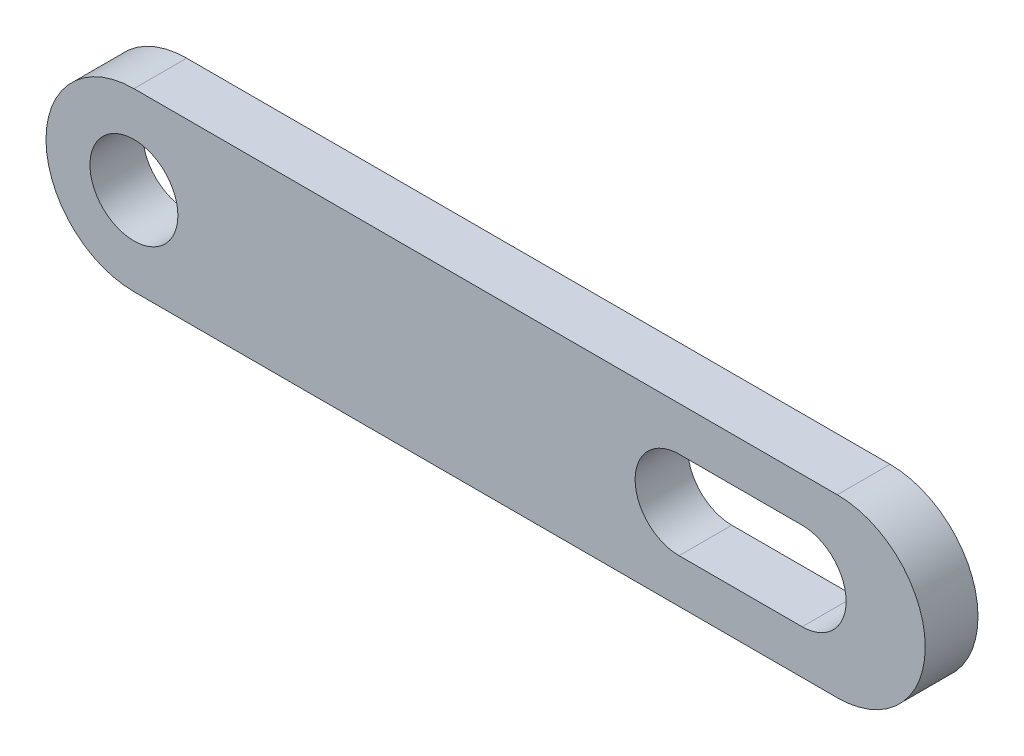
ISO-10303-21;
HEADER;
FILE_DESCRIPTION(('STEP AP214'),'2;1');
FILE_NAME('part.step','',(''),(''),'','','');
FILE_SCHEMA(('AUTOMOTIVE_DESIGN { 1 0 10303 214 1 1 1 1 }'));
ENDSEC;
DATA;
#1=APPLICATION_CONTEXT('core data for automotive mechanical design processes');
#2=APPLICATION_PROTOCOL_DEFINITION('international standard','automotive_design',2000,#1);
#3=PRODUCT_CONTEXT('',#1,'mechanical');
#4=PRODUCT('Part','Part','',(#3));
#5=PRODUCT_RELATED_PRODUCT_CATEGORY('part','',(#4));
#6=PRODUCT_DEFINITION_FORMATION('','',#4);
#7=PRODUCT_DEFINITION_CONTEXT('part definition',#1,'design');
#8=PRODUCT_DEFINITION('design','',#6,#7);
#9=PRODUCT_DEFINITION_SHAPE('','',#8);
#10=(LENGTH_UNIT() NAMED_UNIT(*) SI_UNIT(.MILLI.,.METRE.));
#11=(NAMED_UNIT(*) PLANE_ANGLE_UNIT() SI_UNIT($,.RADIAN.));
#12=(NAMED_UNIT(*) SI_UNIT($,.STERADIAN.) SOLID_ANGLE_UNIT());
#13=UNCERTAINTY_MEASURE_WITH_UNIT(LENGTH_MEASURE(1.E-05),#10,'distance_accuracy_value','');
#14=(GEOMETRIC_REPRESENTATION_CONTEXT(3) GLOBAL_UNCERTAINTY_ASSIGNED_CONTEXT((#13)) GLOBAL_UNIT_ASSIGNED_CONTEXT((#10,
#11,#12)) REPRESENTATION_CONTEXT('',''));
#15=CARTESIAN_POINT('',(0.,0.,0.));
#16=DIRECTION('',(0.,0.,1.));
#17=DIRECTION('',(1.,0.,0.));
#18=AXIS2_PLACEMENT_3D('',#15,#16,#17);
#19=CARTESIAN_POINT('',(-20.,0.,3.));
#20=DIRECTION('',(0.,0.,-1.));
#21=DIRECTION('',(-1.,0.,0.));
#22=AXIS2_PLACEMENT_3D('',#19,#20,#21);
#23=CYLINDRICAL_SURFACE('',#22,5.);
#24=CARTESIAN_POINT('',(-20.,0.,0.));
#25=DIRECTION('',(0.,0.,1.));
#26=DIRECTION('',(1.,0.,0.));
#27=AXIS2_PLACEMENT_3D('',#24,#25,#26);
#28=CIRCLE('',#27,5.);
#29=CARTESIAN_POINT('',(-20.,5.,0.));
#30=VERTEX_POINT('',#29);
#31=CARTESIAN_POINT('',(-20.,-5.,0.));
#32=VERTEX_POINT('',#31);
#33=EDGE_CURVE('E115',#30,#32,#28,.T.);
#34=ORIENTED_EDGE('',*,*,#33,.T.);
#35=DIRECTION('',(0.,0.,-1.));
#36=VECTOR('',#35,1.);
#37=CARTESIAN_POINT('',(-20.,-5.,3.));
#38=LINE('',#37,#36);
#39=CARTESIAN_POINT('',(-20.,-5.,3.));
#40=VERTEX_POINT('',#39);
#41=EDGE_CURVE('E11',#40,#32,#38,.T.);
#42=ORIENTED_EDGE('',*,*,#41,.F.);
#43=CARTESIAN_POINT('',(-20.,0.,3.));
#44=DIRECTION('',(0.,0.,1.));
#45=DIRECTION('',(1.,0.,0.));
#46=AXIS2_PLACEMENT_3D('',#43,#44,#45);
#47=CIRCLE('',#46,5.);
#48=CARTESIAN_POINT('',(-20.,5.,3.));
#49=VERTEX_POINT('',#48);
#50=EDGE_CURVE('E144',#49,#40,#47,.T.);
#51=ORIENTED_EDGE('',*,*,#50,.F.);
#52=DIRECTION('',(0.,0.,-1.));
#53=VECTOR('',#52,1.);
#54=CARTESIAN_POINT('',(-20.,5.,3.));
#55=LINE('',#54,#53);
#56=EDGE_CURVE('E154',#49,#30,#55,.T.);
#57=ORIENTED_EDGE('',*,*,#56,.T.);
#58=EDGE_LOOP('',(#34,#42,#51,#57));
#59=FACE_BOUND('',#58,.T.);
#60=ADVANCED_FACE('F37',(#59),#23,.T.);
#61=CARTESIAN_POINT('',(-20.,-5.,3.));
#62=DIRECTION('',(0.,1.,0.));
#63=DIRECTION('',(-1.,0.,0.));
#64=AXIS2_PLACEMENT_3D('',#61,#62,#63);
#65=PLANE('',#64);
#66=DIRECTION('',(1.,0.,0.));
#67=VECTOR('',#66,1.);
#68=CARTESIAN_POINT('',(-20.,-5.,0.));
#69=LINE('',#68,#67);
#70=CARTESIAN_POINT('',(20.,-4.99999999999999,0.));
#71=VERTEX_POINT('',#70);
#72=EDGE_CURVE('E157',#32,#71,#69,.T.);
#73=ORIENTED_EDGE('',*,*,#72,.T.);
#74=DIRECTION('',(0.,0.,-1.));
#75=VECTOR('',#74,1.);
#76=CARTESIAN_POINT('',(20.,-4.99999999999999,3.));
#77=LINE('',#76,#75);
#78=CARTESIAN_POINT('',(20.,-4.99999999999999,3.));
#79=VERTEX_POINT('',#78);
#80=EDGE_CURVE('E44',#79,#71,#77,.T.);
#81=ORIENTED_EDGE('',*,*,#80,.F.);
#82=DIRECTION('',(1.,0.,0.));
#83=VECTOR('',#82,1.);
#84=CARTESIAN_POINT('',(-20.,-5.,3.));
#85=LINE('',#84,#83);
#86=EDGE_CURVE('E147',#40,#79,#85,.T.);
#87=ORIENTED_EDGE('',*,*,#86,.F.);
#88=ORIENTED_EDGE('',*,*,#41,.T.);
#89=EDGE_LOOP('',(#73,#81,#87,#88));
#90=FACE_BOUND('',#89,.T.);
#91=ADVANCED_FACE('F186',(#90),#65,.F.);
#92=CARTESIAN_POINT('',(20.,0.,3.));
#93=DIRECTION('',(0.,0.,-1.));
#94=DIRECTION('',(-1.,0.,0.));
#95=AXIS2_PLACEMENT_3D('',#92,#93,#94);
#96=CYLINDRICAL_SURFACE('',#95,5.);
#97=CARTESIAN_POINT('',(20.,0.,0.));
#98=DIRECTION('',(0.,0.,1.));
#99=DIRECTION('',(1.,0.,0.));
#100=AXIS2_PLACEMENT_3D('',#97,#98,#99);
#101=CIRCLE('',#100,5.);
#102=CARTESIAN_POINT('',(20.,5.00000000000001,0.));
#103=VERTEX_POINT('',#102);
#104=EDGE_CURVE('E159',#71,#103,#101,.T.);
#105=ORIENTED_EDGE('',*,*,#104,.T.);
#106=DIRECTION('',(0.,0.,-1.));
#107=VECTOR('',#106,1.);
#108=CARTESIAN_POINT('',(20.,5.00000000000001,3.));
#109=LINE('',#108,#107);
#110=CARTESIAN_POINT('',(20.,5.00000000000001,3.));
#111=VERTEX_POINT('',#110);
#112=EDGE_CURVE('E164',#111,#103,#109,.T.);
#113=ORIENTED_EDGE('',*,*,#112,.F.);
#114=CARTESIAN_POINT('',(20.,0.,3.));
#115=DIRECTION('',(0.,0.,1.));
#116=DIRECTION('',(1.,0.,0.));
#117=AXIS2_PLACEMENT_3D('',#114,#115,#116);
#118=CIRCLE('',#117,5.);
#119=EDGE_CURVE('E150',#79,#111,#118,.T.);
#120=ORIENTED_EDGE('',*,*,#119,.F.);
#121=ORIENTED_EDGE('',*,*,#80,.T.);
#122=EDGE_LOOP('',(#105,#113,#120,#121));
#123=FACE_BOUND('',#122,.T.);
#124=ADVANCED_FACE('F171',(#123),#96,.T.);
#125=CARTESIAN_POINT('',(-20.,5.,3.));
#126=DIRECTION('',(0.,-1.,0.));
#127=DIRECTION('',(1.,0.,0.));
#128=AXIS2_PLACEMENT_3D('',#125,#126,#127);
#129=PLANE('',#128);
#130=DIRECTION('',(-1.,0.,0.));
#131=VECTOR('',#130,1.);
#132=CARTESIAN_POINT('',(-20.,5.,0.));
#133=LINE('',#132,#131);
#134=EDGE_CURVE('E148',#103,#30,#133,.T.);
#135=ORIENTED_EDGE('',*,*,#134,.T.);
#136=ORIENTED_EDGE('',*,*,#56,.F.);
#137=DIRECTION('',(-1.,0.,0.));
#138=VECTOR('',#137,1.);
#139=CARTESIAN_POINT('',(-20.,5.,3.));
#140=LINE('',#139,#138);
#141=EDGE_CURVE('E152',#111,#49,#140,.T.);
#142=ORIENTED_EDGE('',*,*,#141,.F.);
#143=ORIENTED_EDGE('',*,*,#112,.T.);
#144=EDGE_LOOP('',(#135,#136,#142,#143));
#145=FACE_BOUND('',#144,.T.);
#146=ADVANCED_FACE('F179',(#145),#129,.F.);
#147=CARTESIAN_POINT('',(-20.,0.,3.));
#148=DIRECTION('',(0.,0.,1.));
#149=DIRECTION('',(1.,0.,0.));
#150=AXIS2_PLACEMENT_3D('',#147,#148,#149);
#151=PLANE('',#150);
#152=CARTESIAN_POINT('',(11.,0.,3.));
#153=DIRECTION('',(0.,0.,1.));
#154=DIRECTION('',(1.,0.,0.));
#155=AXIS2_PLACEMENT_3D('',#152,#153,#154);
#156=CIRCLE('',#155,2.5);
#157=CARTESIAN_POINT('',(11.,2.5,3.));
#158=VERTEX_POINT('',#157);
#159=CARTESIAN_POINT('',(11.,-2.5,3.));
#160=VERTEX_POINT('',#159);
#161=EDGE_CURVE('E51',#158,#160,#156,.T.);
#162=ORIENTED_EDGE('',*,*,#161,.F.);
#163=DIRECTION('',(-1.,0.,0.));
#164=VECTOR('',#163,1.);
#165=CARTESIAN_POINT('',(11.,2.5,3.));
#166=LINE('',#165,#164);
#167=CARTESIAN_POINT('',(18.,2.5,3.));
#168=VERTEX_POINT('',#167);
#169=EDGE_CURVE('E109',#168,#158,#166,.T.);
#170=ORIENTED_EDGE('',*,*,#169,.F.);
#171=CARTESIAN_POINT('',(18.,0.,3.));
#172=DIRECTION('',(0.,0.,1.));
#173=DIRECTION('',(1.,0.,0.));
#174=AXIS2_PLACEMENT_3D('',#171,#172,#173);
#175=CIRCLE('',#174,2.5);
#176=CARTESIAN_POINT('',(18.,-2.5,3.));
#177=VERTEX_POINT('',#176);
#178=EDGE_CURVE('E129',#177,#168,#175,.T.);
#179=ORIENTED_EDGE('',*,*,#178,.F.);
#180=DIRECTION('',(1.,0.,0.));
#181=VECTOR('',#180,1.);
#182=CARTESIAN_POINT('',(11.,-2.5,3.));
#183=LINE('',#182,#181);
#184=EDGE_CURVE('E123',#160,#177,#183,.T.);
#185=ORIENTED_EDGE('',*,*,#184,.F.);
#186=EDGE_LOOP('',(#162,#170,#179,#185));
#187=FACE_BOUND('',#186,.T.);
#188=CARTESIAN_POINT('',(-20.,0.,3.));
#189=DIRECTION('',(0.,0.,1.));
#190=DIRECTION('',(1.,0.,0.));
#191=AXIS2_PLACEMENT_3D('',#188,#189,#190);
#192=CIRCLE('',#191,2.5);
#193=CARTESIAN_POINT('',(-17.5,0.,3.));
#194=VERTEX_POINT('',#193);
#195=EDGE_CURVE('E138',#194,#194,#192,.T.);
#196=ORIENTED_EDGE('',*,*,#195,.F.);
#197=EDGE_LOOP('',(#196));
#198=FACE_BOUND('',#197,.T.);
#199=ORIENTED_EDGE('',*,*,#50,.T.);
#200=ORIENTED_EDGE('',*,*,#86,.T.);
#201=ORIENTED_EDGE('',*,*,#119,.T.);
#202=ORIENTED_EDGE('',*,*,#141,.T.);
#203=EDGE_LOOP('',(#199,#200,#201,#202));
#204=FACE_BOUND('',#203,.T.);
#205=ADVANCED_FACE('F185',(#187,#198,#204),#151,.T.);
#206=CARTESIAN_POINT('',(-20.,0.,0.));
#207=DIRECTION('',(0.,0.,1.));
#208=DIRECTION('',(1.,0.,0.));
#209=AXIS2_PLACEMENT_3D('',#206,#207,#208);
#210=PLANE('',#209);
#211=DIRECTION('',(1.,0.,0.));
#212=VECTOR('',#211,1.);
#213=CARTESIAN_POINT('',(11.,2.5,0.));
#214=LINE('',#213,#212);
#215=CARTESIAN_POINT('',(11.,2.5,0.));
#216=VERTEX_POINT('',#215);
#217=CARTESIAN_POINT('',(18.,2.5,0.));
#218=VERTEX_POINT('',#217);
#219=EDGE_CURVE('E121',#216,#218,#214,.T.);
#220=ORIENTED_EDGE('',*,*,#219,.F.);
#221=CARTESIAN_POINT('',(11.,0.,0.));
#222=DIRECTION('',(0.,0.,1.));
#223=DIRECTION('',(1.,0.,0.));
#224=AXIS2_PLACEMENT_3D('',#221,#222,#223);
#225=CIRCLE('',#224,2.5);
#226=CARTESIAN_POINT('',(11.,-2.5,0.));
#227=VERTEX_POINT('',#226);
#228=EDGE_CURVE('E103',#227,#216,#225,.F.);
#229=ORIENTED_EDGE('',*,*,#228,.F.);
#230=DIRECTION('',(-1.,0.,0.));
#231=VECTOR('',#230,1.);
#232=CARTESIAN_POINT('',(11.,-2.5,0.));
#233=LINE('',#232,#231);
#234=CARTESIAN_POINT('',(18.,-2.5,0.));
#235=VERTEX_POINT('',#234);
#236=EDGE_CURVE('E112',#235,#227,#233,.T.);
#237=ORIENTED_EDGE('',*,*,#236,.F.);
#238=CARTESIAN_POINT('',(18.,0.,0.));
#239=DIRECTION('',(0.,0.,1.));
#240=DIRECTION('',(1.,0.,0.));
#241=AXIS2_PLACEMENT_3D('',#238,#239,#240);
#242=CIRCLE('',#241,2.5);
#243=EDGE_CURVE('E59',#218,#235,#242,.F.);
#244=ORIENTED_EDGE('',*,*,#243,.F.);
#245=EDGE_LOOP('',(#220,#229,#237,#244));
#246=FACE_BOUND('',#245,.T.);
#247=CARTESIAN_POINT('',(-20.,0.,0.));
#248=DIRECTION('',(0.,0.,1.));
#249=DIRECTION('',(1.,0.,0.));
#250=AXIS2_PLACEMENT_3D('',#247,#248,#249);
#251=CIRCLE('',#250,2.5);
#252=CARTESIAN_POINT('',(-17.5,0.,0.));
#253=VERTEX_POINT('',#252);
#254=EDGE_CURVE('E141',#253,#253,#251,.F.);
#255=ORIENTED_EDGE('',*,*,#254,.F.);
#256=EDGE_LOOP('',(#255));
#257=FACE_BOUND('',#256,.T.);
#258=ORIENTED_EDGE('',*,*,#33,.F.);
#259=ORIENTED_EDGE('',*,*,#134,.F.);
#260=ORIENTED_EDGE('',*,*,#104,.F.);
#261=ORIENTED_EDGE('',*,*,#72,.F.);
#262=EDGE_LOOP('',(#258,#259,#260,#261));
#263=FACE_BOUND('',#262,.T.);
#264=ADVANCED_FACE('F118',(#246,#257,#263),#210,.F.);
#265=CARTESIAN_POINT('',(-20.,0.,-0.00100000000000013));
#266=DIRECTION('',(0.,0.,1.));
#267=DIRECTION('',(1.,0.,0.));
#268=AXIS2_PLACEMENT_3D('',#265,#266,#267);
#269=CYLINDRICAL_SURFACE('',#268,2.5);
#270=CARTESIAN_POINT('',(-17.5,0.,3.));
#271=CARTESIAN_POINT('',(-17.5,0.,2.96875));
#272=CARTESIAN_POINT('',(-17.5,0.,2.9375));
#273=CARTESIAN_POINT('',(-17.5,0.,2.875));
#274=CARTESIAN_POINT('',(-17.5,0.,2.84375));
#275=CARTESIAN_POINT('',(-17.5,0.,2.78125));
#276=CARTESIAN_POINT('',(-17.5,0.,2.75));
#277=CARTESIAN_POINT('',(-17.5,0.,2.6875));
#278=CARTESIAN_POINT('',(-17.5,0.,2.65625));
#279=CARTESIAN_POINT('',(-17.5,0.,2.59375));
#280=CARTESIAN_POINT('',(-17.5,0.,2.5625));
#281=CARTESIAN_POINT('',(-17.5,0.,2.5));
#282=CARTESIAN_POINT('',(-17.5,0.,2.46875));
#283=CARTESIAN_POINT('',(-17.5,0.,2.40625));
#284=CARTESIAN_POINT('',(-17.5,0.,2.375));
#285=CARTESIAN_POINT('',(-17.5,0.,2.3125));
#286=CARTESIAN_POINT('',(-17.5,0.,2.28125));
#287=CARTESIAN_POINT('',(-17.5,0.,2.21875));
#288=CARTESIAN_POINT('',(-17.5,0.,2.1875));
#289=CARTESIAN_POINT('',(-17.5,0.,2.125));
#290=CARTESIAN_POINT('',(-17.5,0.,2.09375));
#291=CARTESIAN_POINT('',(-17.5,0.,2.03125));
#292=CARTESIAN_POINT('',(-17.5,0.,2.));
#293=CARTESIAN_POINT('',(-17.5,0.,1.9375));
#294=CARTESIAN_POINT('',(-17.5,0.,1.90625));
#295=CARTESIAN_POINT('',(-17.5,0.,1.84375));
#296=CARTESIAN_POINT('',(-17.5,0.,1.8125));
#297=CARTESIAN_POINT('',(-17.5,0.,1.75));
#298=CARTESIAN_POINT('',(-17.5,0.,1.71875));
#299=CARTESIAN_POINT('',(-17.5,0.,1.65625));
#300=CARTESIAN_POINT('',(-17.5,0.,1.625));
#301=CARTESIAN_POINT('',(-17.5,0.,1.5625));
#302=CARTESIAN_POINT('',(-17.5,0.,1.53125));
#303=CARTESIAN_POINT('',(-17.5,0.,1.46875));
#304=CARTESIAN_POINT('',(-17.5,0.,1.4375));
#305=CARTESIAN_POINT('',(-17.5,0.,1.375));
#306=CARTESIAN_POINT('',(-17.5,0.,1.34375));
#307=CARTESIAN_POINT('',(-17.5,0.,1.28125));
#308=CARTESIAN_POINT('',(-17.5,0.,1.25));
#309=CARTESIAN_POINT('',(-17.5,0.,1.1875));
#310=CARTESIAN_POINT('',(-17.5,0.,1.15625));
#311=CARTESIAN_POINT('',(-17.5,0.,1.09375));
#312=CARTESIAN_POINT('',(-17.5,0.,1.0625));
#313=CARTESIAN_POINT('',(-17.5,0.,1.));
#314=CARTESIAN_POINT('',(-17.5,0.,0.96875));
#315=CARTESIAN_POINT('',(-17.5,0.,0.90625));
#316=CARTESIAN_POINT('',(-17.5,0.,0.875));
#317=CARTESIAN_POINT('',(-17.5,0.,0.8125));
#318=CARTESIAN_POINT('',(-17.5,0.,0.78125));
#319=CARTESIAN_POINT('',(-17.5,0.,0.71875));
#320=CARTESIAN_POINT('',(-17.5,0.,0.6875));
#321=CARTESIAN_POINT('',(-17.5,0.,0.625));
#322=CARTESIAN_POINT('',(-17.5,0.,0.59375));
#323=CARTESIAN_POINT('',(-17.5,0.,0.53125));
#324=CARTESIAN_POINT('',(-17.5,0.,0.5));
#325=CARTESIAN_POINT('',(-17.5,0.,0.4375));
#326=CARTESIAN_POINT('',(-17.5,0.,0.40625));
#327=CARTESIAN_POINT('',(-17.5,0.,0.34375));
#328=CARTESIAN_POINT('',(-17.5,0.,0.3125));
#329=CARTESIAN_POINT('',(-17.5,0.,0.25));
#330=CARTESIAN_POINT('',(-17.5,0.,0.21875));
#331=CARTESIAN_POINT('',(-17.5,0.,0.15625));
#332=CARTESIAN_POINT('',(-17.5,0.,0.125));
#333=CARTESIAN_POINT('',(-17.5,0.,0.0625000000000001));
#334=CARTESIAN_POINT('',(-17.5,0.,0.0312500000000001));
#335=CARTESIAN_POINT('',(-17.5,0.,0.));
#336=B_SPLINE_CURVE_WITH_KNOTS('',3,(#270,#271,#272,#273,#274,#275,#276,#277,#278,#279,#280,
#281,#282,#283,#284,#285,#286,#287,#288,#289,#290,#291,#292,#293,#294,#295,#296,#297,#298,#299,
#300,#301,#302,#303,#304,#305,#306,#307,#308,#309,#310,#311,#312,#313,#314,#315,#316,#317,#318,
#319,#320,#321,#322,#323,#324,#325,#326,#327,#328,#329,#330,#331,#332,#333,#334,#335),
.UNSPECIFIED.,.F.,.F.,(4,2,2,2,2,2,2,2,2,2,2,2,2,2,2,2,2,2,2,2,2,2,2,2,2,2,2,2,2,2,2,2,4),(0.,
0.0937500000000001,0.1875,0.28125,0.375,0.46875,0.5625,0.65625,0.75,0.84375,0.9375,1.03125,
1.125,1.21875,1.3125,1.40625,1.5,1.59375,1.6875,1.78125,1.875,1.96875,2.0625,2.15625,2.25,
2.34375,2.4375,2.53125,2.625,2.71875,2.8125,2.90625,3.),.UNSPECIFIED.);
#337=EDGE_CURVE('BSEAM198',#194,#253,#336,.T.);
#338=ORIENTED_EDGE('',*,*,#195,.T.);
#339=ORIENTED_EDGE('',*,*,#254,.T.);
#340=ORIENTED_EDGE('',*,*,#337,.T.);
#341=ORIENTED_EDGE('',*,*,#337,.F.);
#342=EDGE_LOOP('',(#338,#340,#339,#341));
#343=FACE_BOUND('',#342,.T.);
#344=ADVANCED_FACE('F198',(#343),#269,.F.);
#345=CARTESIAN_POINT('',(11.,0.,-0.00100000000000013));
#346=DIRECTION('',(0.,0.,1.));
#347=DIRECTION('',(1.,0.,0.));
#348=AXIS2_PLACEMENT_3D('',#345,#346,#347);
#349=CYLINDRICAL_SURFACE('',#348,2.5);
#350=ORIENTED_EDGE('',*,*,#228,.T.);
#351=DIRECTION('',(0.,0.,1.));
#352=VECTOR('',#351,1.);
#353=CARTESIAN_POINT('',(11.,2.5,-0.00100000000000013));
#354=LINE('',#353,#352);
#355=EDGE_CURVE('E116',#216,#158,#354,.T.);
#356=ORIENTED_EDGE('',*,*,#355,.T.);
#357=ORIENTED_EDGE('',*,*,#161,.T.);
#358=DIRECTION('',(0.,0.,1.));
#359=VECTOR('',#358,1.);
#360=CARTESIAN_POINT('',(11.,-2.5,-0.00100000000000013));
#361=LINE('',#360,#359);
#362=EDGE_CURVE('E99',#227,#160,#361,.T.);
#363=ORIENTED_EDGE('',*,*,#362,.F.);
#364=EDGE_LOOP('',(#350,#356,#357,#363));
#365=FACE_BOUND('',#364,.T.);
#366=ADVANCED_FACE('F101',(#365),#349,.F.);
#367=CARTESIAN_POINT('',(11.,2.5,-0.00100000000000013));
#368=DIRECTION('',(0.,1.,0.));
#369=DIRECTION('',(0.,0.,1.));
#370=AXIS2_PLACEMENT_3D('',#367,#368,#369);
#371=PLANE('',#370);
#372=ORIENTED_EDGE('',*,*,#219,.T.);
#373=DIRECTION('',(0.,0.,1.));
#374=VECTOR('',#373,1.);
#375=CARTESIAN_POINT('',(18.,2.5,-0.00100000000000013));
#376=LINE('',#375,#374);
#377=EDGE_CURVE('E135',#218,#168,#376,.T.);
#378=ORIENTED_EDGE('',*,*,#377,.T.);
#379=ORIENTED_EDGE('',*,*,#169,.T.);
#380=ORIENTED_EDGE('',*,*,#355,.F.);
#381=EDGE_LOOP('',(#372,#378,#379,#380));
#382=FACE_BOUND('',#381,.T.);
#383=ADVANCED_FACE('F207',(#382),#371,.F.);
#384=CARTESIAN_POINT('',(18.,0.,-0.00100000000000013));
#385=DIRECTION('',(0.,0.,1.));
#386=DIRECTION('',(1.,0.,0.));
#387=AXIS2_PLACEMENT_3D('',#384,#385,#386);
#388=CYLINDRICAL_SURFACE('',#387,2.5);
#389=ORIENTED_EDGE('',*,*,#243,.T.);
#390=DIRECTION('',(0.,0.,1.));
#391=VECTOR('',#390,1.);
#392=CARTESIAN_POINT('',(18.,-2.5,-0.00100000000000013));
#393=LINE('',#392,#391);
#394=EDGE_CURVE('E108',#235,#177,#393,.T.);
#395=ORIENTED_EDGE('',*,*,#394,.T.);
#396=ORIENTED_EDGE('',*,*,#178,.T.);
#397=ORIENTED_EDGE('',*,*,#377,.F.);
#398=EDGE_LOOP('',(#389,#395,#396,#397));
#399=FACE_BOUND('',#398,.T.);
#400=ADVANCED_FACE('F210',(#399),#388,.F.);
#401=CARTESIAN_POINT('',(11.,-2.5,-0.00100000000000013));
#402=DIRECTION('',(0.,-1.,0.));
#403=DIRECTION('',(0.,0.,-1.));
#404=AXIS2_PLACEMENT_3D('',#401,#402,#403);
#405=PLANE('',#404);
#406=ORIENTED_EDGE('',*,*,#236,.T.);
#407=ORIENTED_EDGE('',*,*,#362,.T.);
#408=ORIENTED_EDGE('',*,*,#184,.T.);
#409=ORIENTED_EDGE('',*,*,#394,.F.);
#410=EDGE_LOOP('',(#406,#407,#408,#409));
#411=FACE_BOUND('',#410,.T.);
#412=ADVANCED_FACE('F113',(#411),#405,.F.);
#413=CLOSED_SHELL('',(#60,#91,#124,#146,#205,#264,#344,#366,#383,#400,#412));
#414=MANIFOLD_SOLID_BREP('B2',#413);
#415=ADVANCED_BREP_SHAPE_REPRESENTATION('',(#18,#414),#14);
#416=SHAPE_DEFINITION_REPRESENTATION(#9,#415);
ENDSEC;
END-ISO-10303-21;
